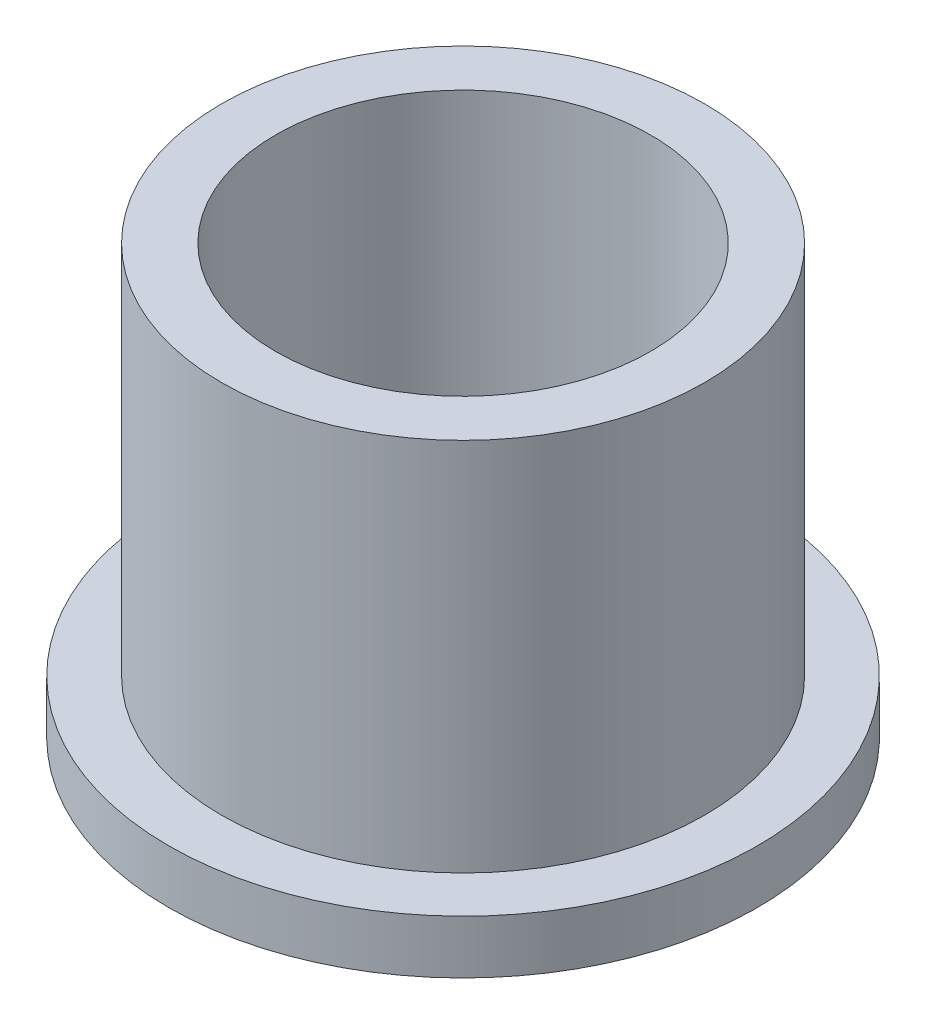
ISO-10303-21;
HEADER;
FILE_DESCRIPTION(('STEP AP214'),'2;1');
FILE_NAME('part.step','',(''),(''),'','','');
FILE_SCHEMA(('AUTOMOTIVE_DESIGN { 1 0 10303 214 1 1 1 1 }'));
ENDSEC;
DATA;
#1=APPLICATION_CONTEXT('core data for automotive mechanical design processes');
#2=APPLICATION_PROTOCOL_DEFINITION('international standard','automotive_design',2000,#1);
#3=PRODUCT_CONTEXT('',#1,'mechanical');
#4=PRODUCT('Part','Part','',(#3));
#5=PRODUCT_RELATED_PRODUCT_CATEGORY('part','',(#4));
#6=PRODUCT_DEFINITION_FORMATION('','',#4);
#7=PRODUCT_DEFINITION_CONTEXT('part definition',#1,'design');
#8=PRODUCT_DEFINITION('design','',#6,#7);
#9=PRODUCT_DEFINITION_SHAPE('','',#8);
#10=(LENGTH_UNIT() NAMED_UNIT(*) SI_UNIT(.MILLI.,.METRE.));
#11=(NAMED_UNIT(*) PLANE_ANGLE_UNIT() SI_UNIT($,.RADIAN.));
#12=(NAMED_UNIT(*) SI_UNIT($,.STERADIAN.) SOLID_ANGLE_UNIT());
#13=UNCERTAINTY_MEASURE_WITH_UNIT(LENGTH_MEASURE(1.E-05),#10,'distance_accuracy_value','');
#14=(GEOMETRIC_REPRESENTATION_CONTEXT(3) GLOBAL_UNCERTAINTY_ASSIGNED_CONTEXT((#13)) GLOBAL_UNIT_ASSIGNED_CONTEXT((#10,
#11,#12)) REPRESENTATION_CONTEXT('',''));
#15=CARTESIAN_POINT('',(0.,0.,0.));
#16=DIRECTION('',(0.,0.,1.));
#17=DIRECTION('',(1.,0.,0.));
#18=AXIS2_PLACEMENT_3D('',#15,#16,#17);
#19=CARTESIAN_POINT('',(0.,12.7,0.));
#20=DIRECTION('',(0.,1.,0.));
#21=DIRECTION('',(0.,0.,1.));
#22=AXIS2_PLACEMENT_3D('',#19,#20,#21);
#23=PLANE('',#22);
#24=CARTESIAN_POINT('',(0.,12.7,0.));
#25=DIRECTION('',(0.,1.,0.));
#26=DIRECTION('',(0.,0.,1.));
#27=AXIS2_PLACEMENT_3D('',#24,#25,#26);
#28=CIRCLE('',#27,7.1628);
#29=CARTESIAN_POINT('',(0.,12.7,7.1628));
#30=VERTEX_POINT('',#29);
#31=EDGE_CURVE('E10',#30,#30,#28,.T.);
#32=ORIENTED_EDGE('',*,*,#31,.T.);
#33=EDGE_LOOP('',(#32));
#34=FACE_BOUND('',#33,.T.);
#35=CARTESIAN_POINT('',(0.,12.7,0.));
#36=DIRECTION('',(0.,1.,0.));
#37=DIRECTION('',(0.,0.,1.));
#38=AXIS2_PLACEMENT_3D('',#35,#36,#37);
#39=CIRCLE('',#38,5.5626);
#40=CARTESIAN_POINT('',(0.,12.7,5.5626));
#41=VERTEX_POINT('',#40);
#42=EDGE_CURVE('E44',#41,#41,#39,.T.);
#43=ORIENTED_EDGE('',*,*,#42,.F.);
#44=EDGE_LOOP('',(#43));
#45=FACE_BOUND('',#44,.T.);
#46=ADVANCED_FACE('F37',(#34,#45),#23,.T.);
#47=CARTESIAN_POINT('',(0.,0.,0.));
#48=DIRECTION('',(0.,1.,0.));
#49=DIRECTION('',(0.,0.,1.));
#50=AXIS2_PLACEMENT_3D('',#47,#48,#49);
#51=PLANE('',#50);
#52=CARTESIAN_POINT('',(0.,0.,0.));
#53=DIRECTION('',(0.,1.,0.));
#54=DIRECTION('',(0.,0.,1.));
#55=AXIS2_PLACEMENT_3D('',#52,#53,#54);
#56=CIRCLE('',#55,5.5626);
#57=CARTESIAN_POINT('',(0.,0.,5.5626));
#58=VERTEX_POINT('',#57);
#59=EDGE_CURVE('E48',#58,#58,#56,.T.);
#60=ORIENTED_EDGE('',*,*,#59,.T.);
#61=EDGE_LOOP('',(#60));
#62=FACE_BOUND('',#61,.T.);
#63=CARTESIAN_POINT('',(0.,0.,0.));
#64=DIRECTION('',(0.,1.,0.));
#65=DIRECTION('',(0.,0.,1.));
#66=AXIS2_PLACEMENT_3D('',#63,#64,#65);
#67=CIRCLE('',#66,8.73125);
#68=CARTESIAN_POINT('',(0.,0.,8.73125));
#69=VERTEX_POINT('',#68);
#70=EDGE_CURVE('E55',#69,#69,#67,.T.);
#71=ORIENTED_EDGE('',*,*,#70,.F.);
#72=EDGE_LOOP('',(#71));
#73=FACE_BOUND('',#72,.T.);
#74=ADVANCED_FACE('F81',(#62,#73),#51,.F.);
#75=CARTESIAN_POINT('',(0.,12.7,0.));
#76=DIRECTION('',(0.,-1.,0.));
#77=DIRECTION('',(0.,0.,-1.));
#78=AXIS2_PLACEMENT_3D('',#75,#76,#77);
#79=CYLINDRICAL_SURFACE('',#78,7.1628);
#80=CARTESIAN_POINT('',(0.,1.5875,0.));
#81=DIRECTION('',(0.,1.,0.));
#82=DIRECTION('',(0.,0.,1.));
#83=AXIS2_PLACEMENT_3D('',#80,#81,#82);
#84=CIRCLE('',#83,7.1628);
#85=CARTESIAN_POINT('',(0.,1.5875,7.1628));
#86=VERTEX_POINT('',#85);
#87=EDGE_CURVE('E58',#86,#86,#84,.T.);
#88=ORIENTED_EDGE('',*,*,#87,.T.);
#89=EDGE_LOOP('',(#88));
#90=FACE_BOUND('',#89,.T.);
#91=ORIENTED_EDGE('',*,*,#31,.F.);
#92=EDGE_LOOP('',(#91));
#93=FACE_BOUND('',#92,.T.);
#94=ADVANCED_FACE('F39',(#90,#93),#79,.T.);
#95=CARTESIAN_POINT('',(0.,12.7,0.));
#96=DIRECTION('',(0.,-1.,0.));
#97=DIRECTION('',(0.,0.,-1.));
#98=AXIS2_PLACEMENT_3D('',#95,#96,#97);
#99=CYLINDRICAL_SURFACE('',#98,5.5626);
#100=ORIENTED_EDGE('',*,*,#42,.T.);
#101=EDGE_LOOP('',(#100));
#102=FACE_BOUND('',#101,.T.);
#103=ORIENTED_EDGE('',*,*,#59,.F.);
#104=EDGE_LOOP('',(#103));
#105=FACE_BOUND('',#104,.T.);
#106=ADVANCED_FACE('F69',(#102,#105),#99,.F.);
#107=CARTESIAN_POINT('',(0.,1.5875,0.));
#108=DIRECTION('',(0.,1.,0.));
#109=DIRECTION('',(0.,0.,1.));
#110=AXIS2_PLACEMENT_3D('',#107,#108,#109);
#111=PLANE('',#110);
#112=CARTESIAN_POINT('',(0.,1.5875,0.));
#113=DIRECTION('',(0.,1.,0.));
#114=DIRECTION('',(0.,0.,1.));
#115=AXIS2_PLACEMENT_3D('',#112,#113,#114);
#116=CIRCLE('',#115,8.73125);
#117=CARTESIAN_POINT('',(0.,1.5875,8.73125));
#118=VERTEX_POINT('',#117);
#119=EDGE_CURVE('E53',#118,#118,#116,.T.);
#120=ORIENTED_EDGE('',*,*,#119,.T.);
#121=EDGE_LOOP('',(#120));
#122=FACE_BOUND('',#121,.T.);
#123=ORIENTED_EDGE('',*,*,#87,.F.);
#124=EDGE_LOOP('',(#123));
#125=FACE_BOUND('',#124,.T.);
#126=ADVANCED_FACE('F66',(#122,#125),#111,.T.);
#127=CARTESIAN_POINT('',(0.,1.5875,0.));
#128=DIRECTION('',(0.,-1.,0.));
#129=DIRECTION('',(0.,0.,-1.));
#130=AXIS2_PLACEMENT_3D('',#127,#128,#129);
#131=CYLINDRICAL_SURFACE('',#130,8.73125);
#132=ORIENTED_EDGE('',*,*,#119,.F.);
#133=EDGE_LOOP('',(#132));
#134=FACE_BOUND('',#133,.T.);
#135=ORIENTED_EDGE('',*,*,#70,.T.);
#136=EDGE_LOOP('',(#135));
#137=FACE_BOUND('',#136,.T.);
#138=ADVANCED_FACE('F68',(#134,#137),#131,.T.);
#139=CLOSED_SHELL('',(#46,#74,#94,#106,#126,#138));
#140=MANIFOLD_SOLID_BREP('B2',#139);
#141=ADVANCED_BREP_SHAPE_REPRESENTATION('',(#18,#140),#14);
#142=SHAPE_DEFINITION_REPRESENTATION(#9,#141);
ENDSEC;
END-ISO-10303-21;
